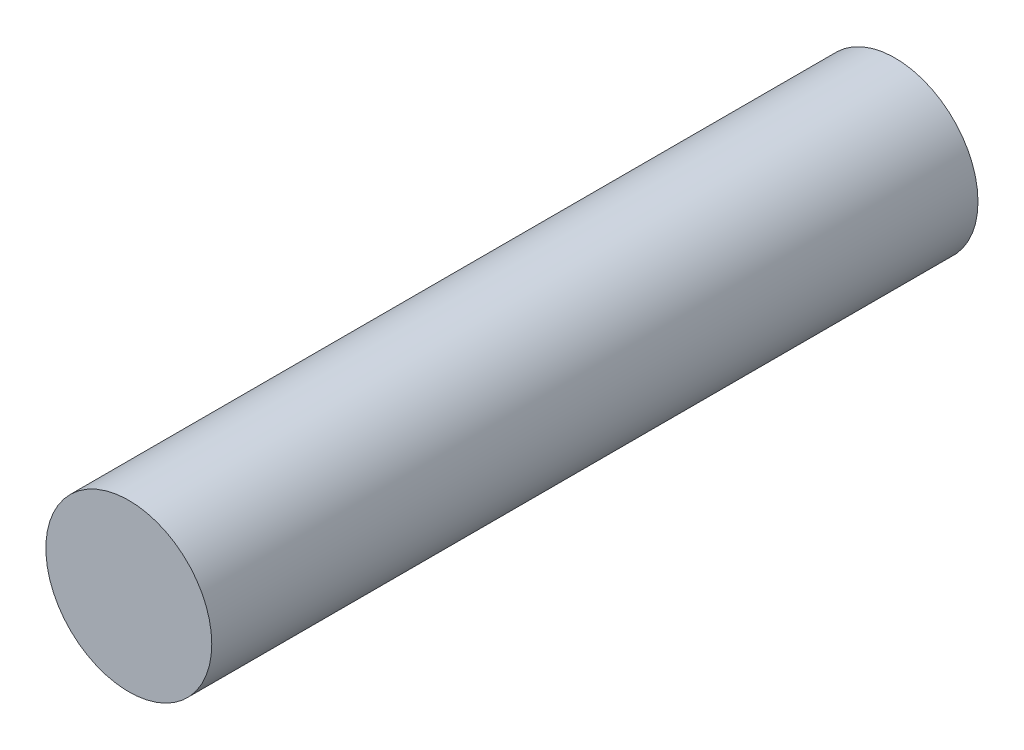
ISO-10303-21;
HEADER;
FILE_DESCRIPTION(('STEP AP214'),'2;1');
FILE_NAME('part.step','',(''),(''),'','','');
FILE_SCHEMA(('AUTOMOTIVE_DESIGN { 1 0 10303 214 1 1 1 1 }'));
ENDSEC;
DATA;
#1=APPLICATION_CONTEXT('core data for automotive mechanical design processes');
#2=APPLICATION_PROTOCOL_DEFINITION('international standard','automotive_design',2000,#1);
#3=PRODUCT_CONTEXT('',#1,'mechanical');
#4=PRODUCT('Part','Part','',(#3));
#5=PRODUCT_RELATED_PRODUCT_CATEGORY('part','',(#4));
#6=PRODUCT_DEFINITION_FORMATION('','',#4);
#7=PRODUCT_DEFINITION_CONTEXT('part definition',#1,'design');
#8=PRODUCT_DEFINITION('design','',#6,#7);
#9=PRODUCT_DEFINITION_SHAPE('','',#8);
#10=(LENGTH_UNIT() NAMED_UNIT(*) SI_UNIT(.MILLI.,.METRE.));
#11=(NAMED_UNIT(*) PLANE_ANGLE_UNIT() SI_UNIT($,.RADIAN.));
#12=(NAMED_UNIT(*) SI_UNIT($,.STERADIAN.) SOLID_ANGLE_UNIT());
#13=UNCERTAINTY_MEASURE_WITH_UNIT(LENGTH_MEASURE(1.E-05),#10,'distance_accuracy_value','');
#14=(GEOMETRIC_REPRESENTATION_CONTEXT(3) GLOBAL_UNCERTAINTY_ASSIGNED_CONTEXT((#13)) GLOBAL_UNIT_ASSIGNED_CONTEXT((#10,
#11,#12)) REPRESENTATION_CONTEXT('',''));
#15=CARTESIAN_POINT('',(0.,0.,0.));
#16=DIRECTION('',(0.,0.,1.));
#17=DIRECTION('',(1.,0.,0.));
#18=AXIS2_PLACEMENT_3D('',#15,#16,#17);
#19=CARTESIAN_POINT('',(0.,0.,18.47));
#20=DIRECTION('',(0.,0.,-1.));
#21=DIRECTION('',(-1.,0.,0.));
#22=AXIS2_PLACEMENT_3D('',#19,#20,#21);
#23=CYLINDRICAL_SURFACE('',#22,2.);
#24=CARTESIAN_POINT('',(0.,0.,18.47));
#25=DIRECTION('',(0.,0.,1.));
#26=DIRECTION('',(1.,0.,0.));
#27=AXIS2_PLACEMENT_3D('',#24,#25,#26);
#28=CIRCLE('',#27,2.);
#29=CARTESIAN_POINT('',(2.,0.,18.47));
#30=VERTEX_POINT('',#29);
#31=EDGE_CURVE('E10',#30,#30,#28,.T.);
#32=ORIENTED_EDGE('',*,*,#31,.F.);
#33=EDGE_LOOP('',(#32));
#34=FACE_BOUND('',#33,.T.);
#35=CARTESIAN_POINT('',(0.,0.,0.));
#36=DIRECTION('',(0.,0.,1.));
#37=DIRECTION('',(1.,0.,0.));
#38=AXIS2_PLACEMENT_3D('',#35,#36,#37);
#39=CIRCLE('',#38,2.);
#40=CARTESIAN_POINT('',(2.,0.,0.));
#41=VERTEX_POINT('',#40);
#42=EDGE_CURVE('E40',#41,#41,#39,.T.);
#43=ORIENTED_EDGE('',*,*,#42,.T.);
#44=EDGE_LOOP('',(#43));
#45=FACE_BOUND('',#44,.T.);
#46=ADVANCED_FACE('F37',(#34,#45),#23,.T.);
#47=CARTESIAN_POINT('',(0.,0.,18.47));
#48=DIRECTION('',(0.,0.,1.));
#49=DIRECTION('',(1.,0.,0.));
#50=AXIS2_PLACEMENT_3D('',#47,#48,#49);
#51=PLANE('',#50);
#52=ORIENTED_EDGE('',*,*,#31,.T.);
#53=EDGE_LOOP('',(#52));
#54=FACE_BOUND('',#53,.T.);
#55=ADVANCED_FACE('F52',(#54),#51,.T.);
#56=CARTESIAN_POINT('',(0.,0.,0.));
#57=DIRECTION('',(0.,0.,1.));
#58=DIRECTION('',(1.,0.,0.));
#59=AXIS2_PLACEMENT_3D('',#56,#57,#58);
#60=PLANE('',#59);
#61=ORIENTED_EDGE('',*,*,#42,.F.);
#62=EDGE_LOOP('',(#61));
#63=FACE_BOUND('',#62,.T.);
#64=ADVANCED_FACE('F50',(#63),#60,.F.);
#65=CLOSED_SHELL('',(#46,#55,#64));
#66=MANIFOLD_SOLID_BREP('B2',#65);
#67=ADVANCED_BREP_SHAPE_REPRESENTATION('',(#18,#66),#14);
#68=SHAPE_DEFINITION_REPRESENTATION(#9,#67);
ENDSEC;
END-ISO-10303-21;
